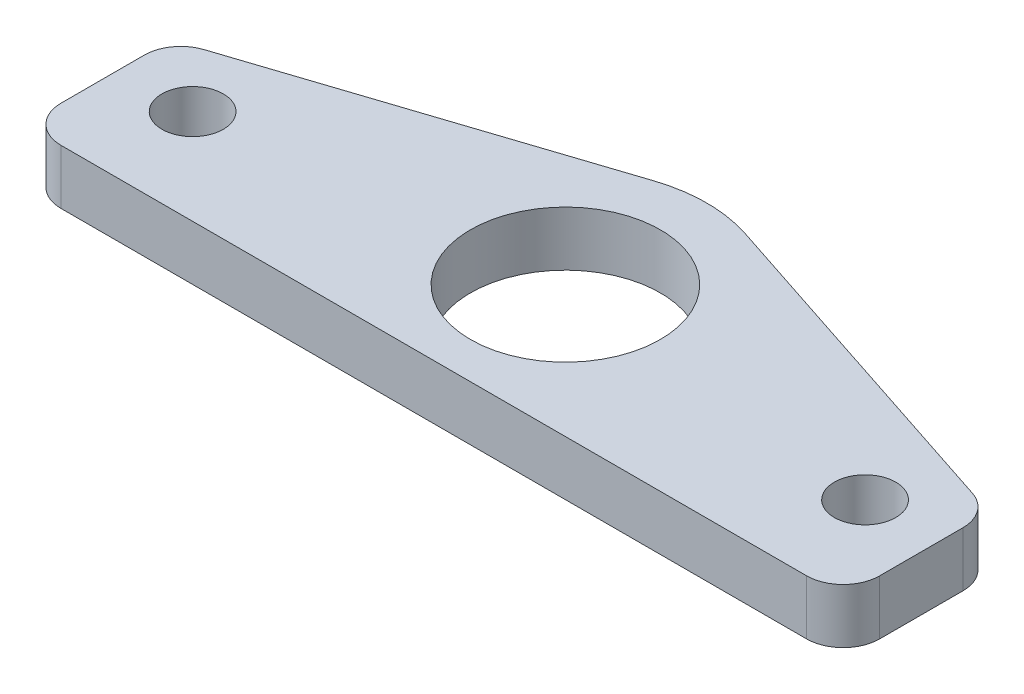
ISO-10303-21;
HEADER;
FILE_DESCRIPTION(('STEP AP214'),'2;1');
FILE_NAME('part.step','',(''),(''),'','','');
FILE_SCHEMA(('AUTOMOTIVE_DESIGN { 1 0 10303 214 1 1 1 1 }'));
ENDSEC;
DATA;
#1=APPLICATION_CONTEXT('core data for automotive mechanical design processes');
#2=APPLICATION_PROTOCOL_DEFINITION('international standard','automotive_design',2000,#1);
#3=PRODUCT_CONTEXT('',#1,'mechanical');
#4=PRODUCT('Part','Part','',(#3));
#5=PRODUCT_RELATED_PRODUCT_CATEGORY('part','',(#4));
#6=PRODUCT_DEFINITION_FORMATION('','',#4);
#7=PRODUCT_DEFINITION_CONTEXT('part definition',#1,'design');
#8=PRODUCT_DEFINITION('design','',#6,#7);
#9=PRODUCT_DEFINITION_SHAPE('','',#8);
#10=(LENGTH_UNIT() NAMED_UNIT(*) SI_UNIT(.MILLI.,.METRE.));
#11=(NAMED_UNIT(*) PLANE_ANGLE_UNIT() SI_UNIT($,.RADIAN.));
#12=(NAMED_UNIT(*) SI_UNIT($,.STERADIAN.) SOLID_ANGLE_UNIT());
#13=UNCERTAINTY_MEASURE_WITH_UNIT(LENGTH_MEASURE(1.E-05),#10,'distance_accuracy_value','');
#14=(GEOMETRIC_REPRESENTATION_CONTEXT(3) GLOBAL_UNCERTAINTY_ASSIGNED_CONTEXT((#13)) GLOBAL_UNIT_ASSIGNED_CONTEXT((#10,
#11,#12)) REPRESENTATION_CONTEXT('',''));
#15=CARTESIAN_POINT('',(0.,0.,0.));
#16=DIRECTION('',(0.,0.,1.));
#17=DIRECTION('',(1.,0.,0.));
#18=AXIS2_PLACEMENT_3D('',#15,#16,#17);
#19=CARTESIAN_POINT('',(-35.56,0.,7.9375));
#20=DIRECTION('',(0.,-1.,0.));
#21=DIRECTION('',(0.,0.,-1.));
#22=AXIS2_PLACEMENT_3D('',#19,#20,#21);
#23=PLANE('',#22);
#24=DIRECTION('',(-0.95003174904049,0.,-0.312153288970447));
#25=VECTOR('',#24,1.);
#26=CARTESIAN_POINT('',(0.,0.,-16.4465));
#27=LINE('',#26,#25);
#28=CARTESIAN_POINT('',(33.3760866924812,0.,-5.4800715153276));
#29=VERTEX_POINT('',#28);
#30=CARTESIAN_POINT('',(3.96434676992468,0.,-15.1439289184533));
#31=VERTEX_POINT('',#30);
#32=EDGE_CURVE('E127',#29,#31,#27,.T.);
#33=ORIENTED_EDGE('',*,*,#32,.F.);
#34=CARTESIAN_POINT('',(32.385,0.,-2.46372071212405));
#35=DIRECTION('',(0.,1.,0.));
#36=DIRECTION('',(0.,0.,1.));
#37=AXIS2_PLACEMENT_3D('',#34,#35,#36);
#38=CIRCLE('',#37,3.175);
#39=CARTESIAN_POINT('',(35.56,0.,-2.46372071212404));
#40=VERTEX_POINT('',#39);
#41=EDGE_CURVE('E162',#40,#29,#38,.T.);
#42=ORIENTED_EDGE('',*,*,#41,.F.);
#43=DIRECTION('',(0.,0.,-1.));
#44=VECTOR('',#43,1.);
#45=CARTESIAN_POINT('',(35.56,0.,7.9375));
#46=LINE('',#45,#44);
#47=CARTESIAN_POINT('',(35.56,0.,4.7625));
#48=VERTEX_POINT('',#47);
#49=EDGE_CURVE('E123',#48,#40,#46,.T.);
#50=ORIENTED_EDGE('',*,*,#49,.F.);
#51=CARTESIAN_POINT('',(32.385,0.,4.7625));
#52=DIRECTION('',(0.,1.,0.));
#53=DIRECTION('',(0.,0.,1.));
#54=AXIS2_PLACEMENT_3D('',#51,#52,#53);
#55=CIRCLE('',#54,3.175);
#56=CARTESIAN_POINT('',(32.385,0.,7.93750000000001));
#57=VERTEX_POINT('',#56);
#58=EDGE_CURVE('E160',#57,#48,#55,.T.);
#59=ORIENTED_EDGE('',*,*,#58,.F.);
#60=DIRECTION('',(1.,0.,0.));
#61=VECTOR('',#60,1.);
#62=CARTESIAN_POINT('',(-35.56,0.,7.9375));
#63=LINE('',#62,#61);
#64=CARTESIAN_POINT('',(-32.385,0.,7.9375));
#65=VERTEX_POINT('',#64);
#66=EDGE_CURVE('E106',#65,#57,#63,.T.);
#67=ORIENTED_EDGE('',*,*,#66,.F.);
#68=CARTESIAN_POINT('',(-32.385,0.,4.7625));
#69=DIRECTION('',(0.,1.,0.));
#70=DIRECTION('',(0.,0.,1.));
#71=AXIS2_PLACEMENT_3D('',#68,#69,#70);
#72=CIRCLE('',#71,3.175);
#73=CARTESIAN_POINT('',(-35.56,0.,4.7625));
#74=VERTEX_POINT('',#73);
#75=EDGE_CURVE('E99',#74,#65,#72,.T.);
#76=ORIENTED_EDGE('',*,*,#75,.F.);
#77=DIRECTION('',(0.,0.,1.));
#78=VECTOR('',#77,1.);
#79=CARTESIAN_POINT('',(-35.56,0.,7.9375));
#80=LINE('',#79,#78);
#81=CARTESIAN_POINT('',(-35.56,0.,-2.46372071212406));
#82=VERTEX_POINT('',#81);
#83=EDGE_CURVE('E89',#82,#74,#80,.T.);
#84=ORIENTED_EDGE('',*,*,#83,.F.);
#85=CARTESIAN_POINT('',(-32.385,0.,-2.46372071212406));
#86=DIRECTION('',(0.,1.,0.));
#87=DIRECTION('',(0.,0.,1.));
#88=AXIS2_PLACEMENT_3D('',#85,#86,#87);
#89=CIRCLE('',#88,3.175);
#90=CARTESIAN_POINT('',(-33.3760866924812,0.,-5.48007151532761));
#91=VERTEX_POINT('',#90);
#92=EDGE_CURVE('E115',#91,#82,#89,.T.);
#93=ORIENTED_EDGE('',*,*,#92,.F.);
#94=DIRECTION('',(-0.95003174904049,0.,0.312153288970447));
#95=VECTOR('',#94,1.);
#96=CARTESIAN_POINT('',(-35.56,0.,-4.7625));
#97=LINE('',#96,#95);
#98=CARTESIAN_POINT('',(-3.96434676992468,0.,-15.1439289184533));
#99=VERTEX_POINT('',#98);
#100=EDGE_CURVE('E131',#99,#91,#97,.T.);
#101=ORIENTED_EDGE('',*,*,#100,.F.);
#102=CARTESIAN_POINT('',(0.,0.,-3.07852570563909));
#103=DIRECTION('',(0.,1.,0.));
#104=DIRECTION('',(0.,0.,1.));
#105=AXIS2_PLACEMENT_3D('',#102,#103,#104);
#106=CIRCLE('',#105,12.7);
#107=EDGE_CURVE('E164',#31,#99,#106,.T.);
#108=ORIENTED_EDGE('',*,*,#107,.F.);
#109=EDGE_LOOP('',(#33,#42,#50,#59,#67,#76,#84,#93,#101,#108));
#110=FACE_BOUND('',#109,.T.);
#111=CARTESIAN_POINT('',(29.21,0.,-0.317500000000015));
#112=DIRECTION('',(0.,1.,0.));
#113=DIRECTION('',(0.,0.,1.));
#114=AXIS2_PLACEMENT_3D('',#111,#112,#113);
#115=CIRCLE('',#114,2.667);
#116=CARTESIAN_POINT('',(29.21,0.,2.34949999999998));
#117=VERTEX_POINT('',#116);
#118=EDGE_CURVE('E110',#117,#117,#115,.T.);
#119=ORIENTED_EDGE('',*,*,#118,.T.);
#120=EDGE_LOOP('',(#119));
#121=FACE_BOUND('',#120,.T.);
#122=CARTESIAN_POINT('',(0.,0.,-3.49250000000001));
#123=DIRECTION('',(0.,1.,0.));
#124=DIRECTION('',(0.,0.,1.));
#125=AXIS2_PLACEMENT_3D('',#122,#123,#124);
#126=CIRCLE('',#125,8.255);
#127=CARTESIAN_POINT('',(0.,0.,4.76249999999999));
#128=VERTEX_POINT('',#127);
#129=EDGE_CURVE('E167',#128,#128,#126,.T.);
#130=ORIENTED_EDGE('',*,*,#129,.T.);
#131=EDGE_LOOP('',(#130));
#132=FACE_BOUND('',#131,.T.);
#133=CARTESIAN_POINT('',(-29.21,0.,-0.317500000000015));
#134=DIRECTION('',(0.,1.,0.));
#135=DIRECTION('',(0.,0.,1.));
#136=AXIS2_PLACEMENT_3D('',#133,#134,#135);
#137=CIRCLE('',#136,2.667);
#138=CARTESIAN_POINT('',(-29.21,0.,2.34949999999998));
#139=VERTEX_POINT('',#138);
#140=EDGE_CURVE('E19',#139,#139,#137,.T.);
#141=ORIENTED_EDGE('',*,*,#140,.T.);
#142=EDGE_LOOP('',(#141));
#143=FACE_BOUND('',#142,.T.);
#144=ADVANCED_FACE('F16',(#110,#121,#132,#143),#23,.T.);
#145=CARTESIAN_POINT('',(-29.21,75.1203359637757,-0.317500000000015));
#146=DIRECTION('',(0.,1.,0.));
#147=DIRECTION('',(0.,0.,1.));
#148=AXIS2_PLACEMENT_3D('',#145,#146,#147);
#149=CYLINDRICAL_SURFACE('',#148,2.667);
#150=ORIENTED_EDGE('',*,*,#140,.F.);
#151=EDGE_LOOP('',(#150));
#152=FACE_BOUND('',#151,.T.);
#153=CARTESIAN_POINT('',(-29.21,4.7498,-0.317500000000015));
#154=DIRECTION('',(0.,1.,0.));
#155=DIRECTION('',(0.,0.,1.));
#156=AXIS2_PLACEMENT_3D('',#153,#154,#155);
#157=CIRCLE('',#156,2.667);
#158=CARTESIAN_POINT('',(-29.21,4.7498,2.34949999999998));
#159=VERTEX_POINT('',#158);
#160=EDGE_CURVE('E156',#159,#159,#157,.T.);
#161=ORIENTED_EDGE('',*,*,#160,.T.);
#162=EDGE_LOOP('',(#161));
#163=FACE_BOUND('',#162,.T.);
#164=ADVANCED_FACE('F175',(#152,#163),#149,.F.);
#165=CARTESIAN_POINT('',(0.,75.1203359637757,-3.49250000000001));
#166=DIRECTION('',(0.,1.,0.));
#167=DIRECTION('',(0.,0.,1.));
#168=AXIS2_PLACEMENT_3D('',#165,#166,#167);
#169=CYLINDRICAL_SURFACE('',#168,8.255);
#170=ORIENTED_EDGE('',*,*,#129,.F.);
#171=EDGE_LOOP('',(#170));
#172=FACE_BOUND('',#171,.T.);
#173=CARTESIAN_POINT('',(0.,4.7498,-3.49250000000001));
#174=DIRECTION('',(0.,1.,0.));
#175=DIRECTION('',(0.,0.,1.));
#176=AXIS2_PLACEMENT_3D('',#173,#174,#175);
#177=CIRCLE('',#176,8.255);
#178=CARTESIAN_POINT('',(0.,4.7498,4.76249999999999));
#179=VERTEX_POINT('',#178);
#180=EDGE_CURVE('E153',#179,#179,#177,.T.);
#181=ORIENTED_EDGE('',*,*,#180,.T.);
#182=EDGE_LOOP('',(#181));
#183=FACE_BOUND('',#182,.T.);
#184=ADVANCED_FACE('F178',(#172,#183),#169,.F.);
#185=CARTESIAN_POINT('',(29.21,75.1203359637757,-0.317500000000015));
#186=DIRECTION('',(0.,1.,0.));
#187=DIRECTION('',(0.,0.,1.));
#188=AXIS2_PLACEMENT_3D('',#185,#186,#187);
#189=CYLINDRICAL_SURFACE('',#188,2.667);
#190=ORIENTED_EDGE('',*,*,#118,.F.);
#191=EDGE_LOOP('',(#190));
#192=FACE_BOUND('',#191,.T.);
#193=CARTESIAN_POINT('',(29.21,4.7498,-0.317500000000015));
#194=DIRECTION('',(0.,1.,0.));
#195=DIRECTION('',(0.,0.,1.));
#196=AXIS2_PLACEMENT_3D('',#193,#194,#195);
#197=CIRCLE('',#196,2.667);
#198=CARTESIAN_POINT('',(29.21,4.7498,2.34949999999998));
#199=VERTEX_POINT('',#198);
#200=EDGE_CURVE('E150',#199,#199,#197,.T.);
#201=ORIENTED_EDGE('',*,*,#200,.T.);
#202=EDGE_LOOP('',(#201));
#203=FACE_BOUND('',#202,.T.);
#204=ADVANCED_FACE('F226',(#192,#203),#189,.F.);
#205=CARTESIAN_POINT('',(-32.385,4.7498,4.7625));
#206=DIRECTION('',(0.,1.,0.));
#207=DIRECTION('',(0.,0.,1.));
#208=AXIS2_PLACEMENT_3D('',#205,#206,#207);
#209=CYLINDRICAL_SURFACE('',#208,3.175);
#210=ORIENTED_EDGE('',*,*,#75,.T.);
#211=DIRECTION('',(0.,1.,0.));
#212=VECTOR('',#211,1.);
#213=CARTESIAN_POINT('',(-32.385,4.7498,7.9375));
#214=LINE('',#213,#212);
#215=CARTESIAN_POINT('',(-32.385,4.7498,7.9375));
#216=VERTEX_POINT('',#215);
#217=EDGE_CURVE('E159',#216,#65,#214,.F.);
#218=ORIENTED_EDGE('',*,*,#217,.F.);
#219=CARTESIAN_POINT('',(-32.385,4.7498,4.7625));
#220=DIRECTION('',(0.,1.,0.));
#221=DIRECTION('',(0.,0.,1.));
#222=AXIS2_PLACEMENT_3D('',#219,#220,#221);
#223=CIRCLE('',#222,3.175);
#224=CARTESIAN_POINT('',(-35.56,4.7498,4.7625));
#225=VERTEX_POINT('',#224);
#226=EDGE_CURVE('E114',#216,#225,#223,.F.);
#227=ORIENTED_EDGE('',*,*,#226,.T.);
#228=DIRECTION('',(0.,1.,0.));
#229=VECTOR('',#228,1.);
#230=CARTESIAN_POINT('',(-35.56,4.7498,4.7625));
#231=LINE('',#230,#229);
#232=EDGE_CURVE('E94',#74,#225,#231,.T.);
#233=ORIENTED_EDGE('',*,*,#232,.F.);
#234=EDGE_LOOP('',(#210,#218,#227,#233));
#235=FACE_BOUND('',#234,.T.);
#236=ADVANCED_FACE('F113',(#235),#209,.T.);
#237=CARTESIAN_POINT('',(-35.56,4.7498,7.9375));
#238=DIRECTION('',(-1.,0.,0.));
#239=DIRECTION('',(0.,0.,1.));
#240=AXIS2_PLACEMENT_3D('',#237,#238,#239);
#241=PLANE('',#240);
#242=DIRECTION('',(0.,0.,-1.));
#243=VECTOR('',#242,1.);
#244=CARTESIAN_POINT('',(-35.56,4.7498,7.9375));
#245=LINE('',#244,#243);
#246=CARTESIAN_POINT('',(-35.56,4.7498,-2.46372071212406));
#247=VERTEX_POINT('',#246);
#248=EDGE_CURVE('E148',#225,#247,#245,.T.);
#249=ORIENTED_EDGE('',*,*,#248,.T.);
#250=DIRECTION('',(0.,1.,0.));
#251=VECTOR('',#250,1.);
#252=CARTESIAN_POINT('',(-35.56,4.7498,-2.46372071212406));
#253=LINE('',#252,#251);
#254=EDGE_CURVE('E96',#82,#247,#253,.T.);
#255=ORIENTED_EDGE('',*,*,#254,.F.);
#256=ORIENTED_EDGE('',*,*,#83,.T.);
#257=ORIENTED_EDGE('',*,*,#232,.T.);
#258=EDGE_LOOP('',(#249,#255,#256,#257));
#259=FACE_BOUND('',#258,.T.);
#260=ADVANCED_FACE('F92',(#259),#241,.T.);
#261=CARTESIAN_POINT('',(-32.385,4.7498,-2.46372071212406));
#262=DIRECTION('',(0.,1.,0.));
#263=DIRECTION('',(0.,0.,1.));
#264=AXIS2_PLACEMENT_3D('',#261,#262,#263);
#265=CYLINDRICAL_SURFACE('',#264,3.175);
#266=ORIENTED_EDGE('',*,*,#92,.T.);
#267=ORIENTED_EDGE('',*,*,#254,.T.);
#268=CARTESIAN_POINT('',(-32.385,4.7498,-2.46372071212406));
#269=DIRECTION('',(0.,1.,0.));
#270=DIRECTION('',(0.,0.,1.));
#271=AXIS2_PLACEMENT_3D('',#268,#269,#270);
#272=CIRCLE('',#271,3.175);
#273=CARTESIAN_POINT('',(-33.3760866924812,4.7498,-5.48007151532762));
#274=VERTEX_POINT('',#273);
#275=EDGE_CURVE('E145',#247,#274,#272,.F.);
#276=ORIENTED_EDGE('',*,*,#275,.T.);
#277=DIRECTION('',(0.,1.,0.));
#278=VECTOR('',#277,1.);
#279=CARTESIAN_POINT('',(-33.3760866924812,4.7498,-5.48007151532761));
#280=LINE('',#279,#278);
#281=EDGE_CURVE('E132',#91,#274,#280,.T.);
#282=ORIENTED_EDGE('',*,*,#281,.F.);
#283=EDGE_LOOP('',(#266,#267,#276,#282));
#284=FACE_BOUND('',#283,.T.);
#285=ADVANCED_FACE('F217',(#284),#265,.T.);
#286=CARTESIAN_POINT('',(-35.56,4.7498,-4.7625));
#287=DIRECTION('',(-0.312153288970447,0.,-0.95003174904049));
#288=DIRECTION('',(-0.95003174904049,0.,0.312153288970447));
#289=AXIS2_PLACEMENT_3D('',#286,#287,#288);
#290=PLANE('',#289);
#291=DIRECTION('',(0.95003174904049,0.,-0.312153288970446));
#292=VECTOR('',#291,1.);
#293=CARTESIAN_POINT('',(-33.3760866924812,4.7498,-5.48007151532762));
#294=LINE('',#293,#292);
#295=CARTESIAN_POINT('',(-3.96434676992467,4.7498,-15.1439289184533));
#296=VERTEX_POINT('',#295);
#297=EDGE_CURVE('E144',#274,#296,#294,.T.);
#298=ORIENTED_EDGE('',*,*,#297,.T.);
#299=DIRECTION('',(0.,1.,0.));
#300=VECTOR('',#299,1.);
#301=CARTESIAN_POINT('',(-3.96434676992467,4.7498,-15.1439289184533));
#302=LINE('',#301,#300);
#303=EDGE_CURVE('E130',#99,#296,#302,.T.);
#304=ORIENTED_EDGE('',*,*,#303,.F.);
#305=ORIENTED_EDGE('',*,*,#100,.T.);
#306=ORIENTED_EDGE('',*,*,#281,.T.);
#307=EDGE_LOOP('',(#298,#304,#305,#306));
#308=FACE_BOUND('',#307,.T.);
#309=ADVANCED_FACE('F213',(#308),#290,.T.);
#310=CARTESIAN_POINT('',(0.,4.7498,-3.07852570563909));
#311=DIRECTION('',(0.,1.,0.));
#312=DIRECTION('',(0.,0.,1.));
#313=AXIS2_PLACEMENT_3D('',#310,#311,#312);
#314=CYLINDRICAL_SURFACE('',#313,12.7);
#315=ORIENTED_EDGE('',*,*,#107,.T.);
#316=ORIENTED_EDGE('',*,*,#303,.T.);
#317=CARTESIAN_POINT('',(0.,4.7498,-3.07852570563909));
#318=DIRECTION('',(0.,1.,0.));
#319=DIRECTION('',(0.,0.,1.));
#320=AXIS2_PLACEMENT_3D('',#317,#318,#319);
#321=CIRCLE('',#320,12.7);
#322=CARTESIAN_POINT('',(3.96434676992467,4.7498,-15.1439289184533));
#323=VERTEX_POINT('',#322);
#324=EDGE_CURVE('E141',#296,#323,#321,.F.);
#325=ORIENTED_EDGE('',*,*,#324,.T.);
#326=DIRECTION('',(0.,1.,0.));
#327=VECTOR('',#326,1.);
#328=CARTESIAN_POINT('',(3.96434676992469,4.7498,-15.1439289184533));
#329=LINE('',#328,#327);
#330=EDGE_CURVE('E129',#31,#323,#329,.T.);
#331=ORIENTED_EDGE('',*,*,#330,.F.);
#332=EDGE_LOOP('',(#315,#316,#325,#331));
#333=FACE_BOUND('',#332,.T.);
#334=ADVANCED_FACE('F209',(#333),#314,.T.);
#335=CARTESIAN_POINT('',(0.,4.7498,-16.4465));
#336=DIRECTION('',(0.312153288970447,0.,-0.95003174904049));
#337=DIRECTION('',(-0.95003174904049,0.,-0.312153288970447));
#338=AXIS2_PLACEMENT_3D('',#335,#336,#337);
#339=PLANE('',#338);
#340=ORIENTED_EDGE('',*,*,#32,.T.);
#341=ORIENTED_EDGE('',*,*,#330,.T.);
#342=DIRECTION('',(0.95003174904049,0.,0.312153288970446));
#343=VECTOR('',#342,1.);
#344=CARTESIAN_POINT('',(3.96434676992468,4.7498,-15.1439289184533));
#345=LINE('',#344,#343);
#346=CARTESIAN_POINT('',(33.3760866924812,4.7498,-5.48007151532761));
#347=VERTEX_POINT('',#346);
#348=EDGE_CURVE('E140',#323,#347,#345,.T.);
#349=ORIENTED_EDGE('',*,*,#348,.T.);
#350=DIRECTION('',(0.,1.,0.));
#351=VECTOR('',#350,1.);
#352=CARTESIAN_POINT('',(33.3760866924812,4.7498,-5.4800715153276));
#353=LINE('',#352,#351);
#354=EDGE_CURVE('E126',#29,#347,#353,.T.);
#355=ORIENTED_EDGE('',*,*,#354,.F.);
#356=EDGE_LOOP('',(#340,#341,#349,#355));
#357=FACE_BOUND('',#356,.T.);
#358=ADVANCED_FACE('F205',(#357),#339,.T.);
#359=CARTESIAN_POINT('',(32.385,4.7498,-2.46372071212405));
#360=DIRECTION('',(0.,1.,0.));
#361=DIRECTION('',(0.,0.,1.));
#362=AXIS2_PLACEMENT_3D('',#359,#360,#361);
#363=CYLINDRICAL_SURFACE('',#362,3.175);
#364=ORIENTED_EDGE('',*,*,#41,.T.);
#365=ORIENTED_EDGE('',*,*,#354,.T.);
#366=CARTESIAN_POINT('',(32.385,4.7498,-2.46372071212405));
#367=DIRECTION('',(0.,1.,0.));
#368=DIRECTION('',(0.,0.,1.));
#369=AXIS2_PLACEMENT_3D('',#366,#367,#368);
#370=CIRCLE('',#369,3.175);
#371=CARTESIAN_POINT('',(35.56,4.7498,-2.46372071212404));
#372=VERTEX_POINT('',#371);
#373=EDGE_CURVE('E137',#347,#372,#370,.F.);
#374=ORIENTED_EDGE('',*,*,#373,.T.);
#375=DIRECTION('',(0.,1.,0.));
#376=VECTOR('',#375,1.);
#377=CARTESIAN_POINT('',(35.56,4.7498,-2.46372071212404));
#378=LINE('',#377,#376);
#379=EDGE_CURVE('E125',#40,#372,#378,.T.);
#380=ORIENTED_EDGE('',*,*,#379,.F.);
#381=EDGE_LOOP('',(#364,#365,#374,#380));
#382=FACE_BOUND('',#381,.T.);
#383=ADVANCED_FACE('F201',(#382),#363,.T.);
#384=CARTESIAN_POINT('',(35.56,4.7498,7.9375));
#385=DIRECTION('',(1.,0.,0.));
#386=DIRECTION('',(0.,0.,-1.));
#387=AXIS2_PLACEMENT_3D('',#384,#385,#386);
#388=PLANE('',#387);
#389=ORIENTED_EDGE('',*,*,#49,.T.);
#390=ORIENTED_EDGE('',*,*,#379,.T.);
#391=DIRECTION('',(0.,0.,-1.));
#392=VECTOR('',#391,1.);
#393=CARTESIAN_POINT('',(35.56,4.7498,7.9375));
#394=LINE('',#393,#392);
#395=CARTESIAN_POINT('',(35.56,4.7498,4.7625));
#396=VERTEX_POINT('',#395);
#397=EDGE_CURVE('E136',#372,#396,#394,.F.);
#398=ORIENTED_EDGE('',*,*,#397,.T.);
#399=DIRECTION('',(0.,1.,0.));
#400=VECTOR('',#399,1.);
#401=CARTESIAN_POINT('',(35.56,4.7498,4.7625));
#402=LINE('',#401,#400);
#403=EDGE_CURVE('E122',#48,#396,#402,.T.);
#404=ORIENTED_EDGE('',*,*,#403,.F.);
#405=EDGE_LOOP('',(#389,#390,#398,#404));
#406=FACE_BOUND('',#405,.T.);
#407=ADVANCED_FACE('F197',(#406),#388,.T.);
#408=CARTESIAN_POINT('',(32.385,4.7498,4.7625));
#409=DIRECTION('',(0.,1.,0.));
#410=DIRECTION('',(0.,0.,1.));
#411=AXIS2_PLACEMENT_3D('',#408,#409,#410);
#412=CYLINDRICAL_SURFACE('',#411,3.175);
#413=ORIENTED_EDGE('',*,*,#58,.T.);
#414=ORIENTED_EDGE('',*,*,#403,.T.);
#415=CARTESIAN_POINT('',(32.385,4.7498,4.7625));
#416=DIRECTION('',(0.,1.,0.));
#417=DIRECTION('',(0.,0.,1.));
#418=AXIS2_PLACEMENT_3D('',#415,#416,#417);
#419=CIRCLE('',#418,3.175);
#420=CARTESIAN_POINT('',(32.385,4.7498,7.9375));
#421=VERTEX_POINT('',#420);
#422=EDGE_CURVE('E25',#396,#421,#419,.F.);
#423=ORIENTED_EDGE('',*,*,#422,.T.);
#424=DIRECTION('',(0.,1.,0.));
#425=VECTOR('',#424,1.);
#426=CARTESIAN_POINT('',(32.385,4.7498,7.93750000000001));
#427=LINE('',#426,#425);
#428=EDGE_CURVE('E33',#57,#421,#427,.T.);
#429=ORIENTED_EDGE('',*,*,#428,.F.);
#430=EDGE_LOOP('',(#413,#414,#423,#429));
#431=FACE_BOUND('',#430,.T.);
#432=ADVANCED_FACE('F190',(#431),#412,.T.);
#433=CARTESIAN_POINT('',(-35.56,4.7498,7.9375));
#434=DIRECTION('',(0.,0.,1.));
#435=DIRECTION('',(1.,0.,0.));
#436=AXIS2_PLACEMENT_3D('',#433,#434,#435);
#437=PLANE('',#436);
#438=DIRECTION('',(1.,0.,0.));
#439=VECTOR('',#438,1.);
#440=CARTESIAN_POINT('',(-35.56,4.7498,7.9375));
#441=LINE('',#440,#439);
#442=EDGE_CURVE('E11',#421,#216,#441,.F.);
#443=ORIENTED_EDGE('',*,*,#442,.T.);
#444=ORIENTED_EDGE('',*,*,#217,.T.);
#445=ORIENTED_EDGE('',*,*,#66,.T.);
#446=ORIENTED_EDGE('',*,*,#428,.T.);
#447=EDGE_LOOP('',(#443,#444,#445,#446));
#448=FACE_BOUND('',#447,.T.);
#449=ADVANCED_FACE('F183',(#448),#437,.T.);
#450=CARTESIAN_POINT('',(-35.56,4.7498,7.9375));
#451=DIRECTION('',(0.,-1.,0.));
#452=DIRECTION('',(0.,0.,-1.));
#453=AXIS2_PLACEMENT_3D('',#450,#451,#452);
#454=PLANE('',#453);
#455=ORIENTED_EDGE('',*,*,#422,.F.);
#456=ORIENTED_EDGE('',*,*,#397,.F.);
#457=ORIENTED_EDGE('',*,*,#373,.F.);
#458=ORIENTED_EDGE('',*,*,#348,.F.);
#459=ORIENTED_EDGE('',*,*,#324,.F.);
#460=ORIENTED_EDGE('',*,*,#297,.F.);
#461=ORIENTED_EDGE('',*,*,#275,.F.);
#462=ORIENTED_EDGE('',*,*,#248,.F.);
#463=ORIENTED_EDGE('',*,*,#226,.F.);
#464=ORIENTED_EDGE('',*,*,#442,.F.);
#465=EDGE_LOOP('',(#455,#456,#457,#458,#459,#460,#461,#462,#463,#464));
#466=FACE_BOUND('',#465,.T.);
#467=ORIENTED_EDGE('',*,*,#200,.F.);
#468=EDGE_LOOP('',(#467));
#469=FACE_BOUND('',#468,.T.);
#470=ORIENTED_EDGE('',*,*,#180,.F.);
#471=EDGE_LOOP('',(#470));
#472=FACE_BOUND('',#471,.T.);
#473=ORIENTED_EDGE('',*,*,#160,.F.);
#474=EDGE_LOOP('',(#473));
#475=FACE_BOUND('',#474,.T.);
#476=ADVANCED_FACE('F181',(#466,#469,#472,#475),#454,.F.);
#477=CLOSED_SHELL('',(#144,#164,#184,#204,#236,#260,#285,#309,#334,#358,#383,#407,#432,#449,#476));
#478=MANIFOLD_SOLID_BREP('B1',#477);
#479=ADVANCED_BREP_SHAPE_REPRESENTATION('',(#18,#478),#14);
#480=SHAPE_DEFINITION_REPRESENTATION(#9,#479);
ENDSEC;
END-ISO-10303-21;
